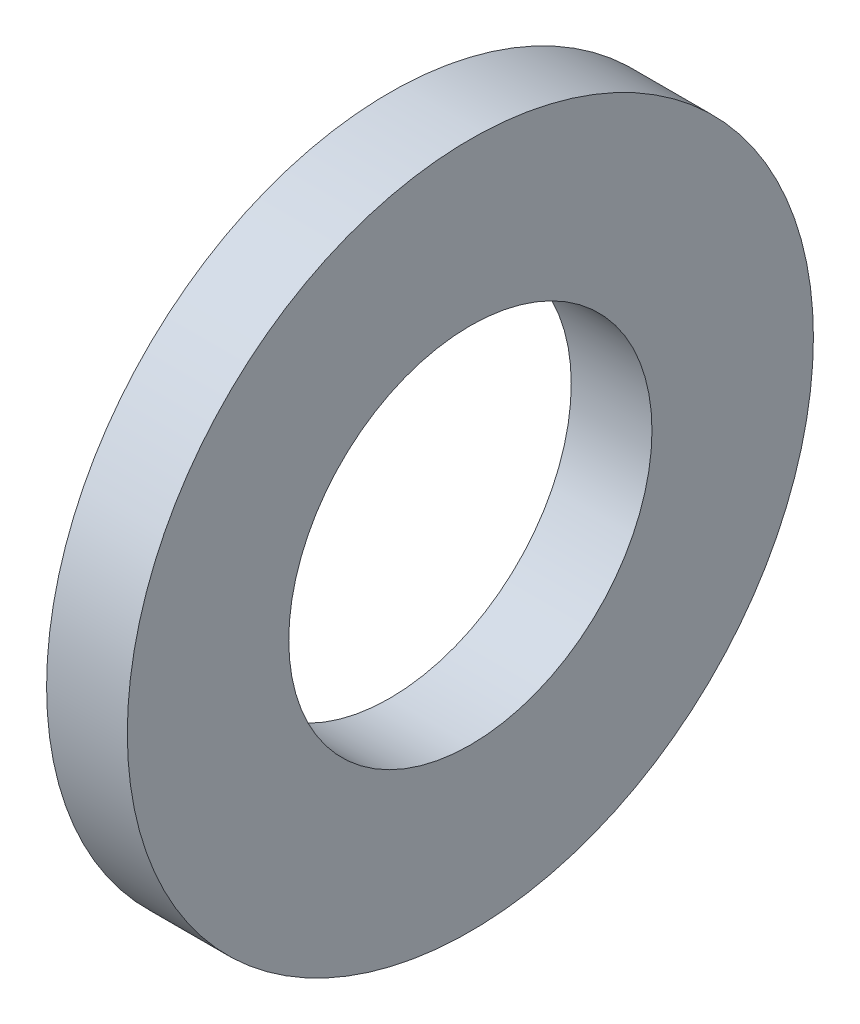
ISO-10303-21;
HEADER;
FILE_DESCRIPTION(('STEP AP214'),'2;1');
FILE_NAME('part.step','',(''),(''),'','','');
FILE_SCHEMA(('AUTOMOTIVE_DESIGN { 1 0 10303 214 1 1 1 1 }'));
ENDSEC;
DATA;
#1=APPLICATION_CONTEXT('core data for automotive mechanical design processes');
#2=APPLICATION_PROTOCOL_DEFINITION('international standard','automotive_design',2000,#1);
#3=PRODUCT_CONTEXT('',#1,'mechanical');
#4=PRODUCT('Part','Part','',(#3));
#5=PRODUCT_RELATED_PRODUCT_CATEGORY('part','',(#4));
#6=PRODUCT_DEFINITION_FORMATION('','',#4);
#7=PRODUCT_DEFINITION_CONTEXT('part definition',#1,'design');
#8=PRODUCT_DEFINITION('design','',#6,#7);
#9=PRODUCT_DEFINITION_SHAPE('','',#8);
#10=(LENGTH_UNIT() NAMED_UNIT(*) SI_UNIT(.MILLI.,.METRE.));
#11=(NAMED_UNIT(*) PLANE_ANGLE_UNIT() SI_UNIT($,.RADIAN.));
#12=(NAMED_UNIT(*) SI_UNIT($,.STERADIAN.) SOLID_ANGLE_UNIT());
#13=UNCERTAINTY_MEASURE_WITH_UNIT(LENGTH_MEASURE(1.E-05),#10,'distance_accuracy_value','');
#14=(GEOMETRIC_REPRESENTATION_CONTEXT(3) GLOBAL_UNCERTAINTY_ASSIGNED_CONTEXT((#13)) GLOBAL_UNIT_ASSIGNED_CONTEXT((#10,
#11,#12)) REPRESENTATION_CONTEXT('',''));
#15=CARTESIAN_POINT('',(0.,0.,0.));
#16=DIRECTION('',(0.,0.,1.));
#17=DIRECTION('',(1.,0.,0.));
#18=AXIS2_PLACEMENT_3D('',#15,#16,#17);
#19=CARTESIAN_POINT('',(-34.9249999999999,0.,0.));
#20=DIRECTION('',(-1.,0.,0.));
#21=DIRECTION('',(0.,0.,1.));
#22=AXIS2_PLACEMENT_3D('',#19,#20,#21);
#23=CYLINDRICAL_SURFACE('',#22,9.);
#24=CARTESIAN_POINT('',(0.,0.,0.));
#25=DIRECTION('',(-1.,0.,0.));
#26=DIRECTION('',(0.,0.,1.));
#27=AXIS2_PLACEMENT_3D('',#24,#25,#26);
#28=CIRCLE('',#27,9.);
#29=CARTESIAN_POINT('',(0.,0.,9.));
#30=VERTEX_POINT('',#29);
#31=EDGE_CURVE('E10',#30,#30,#28,.T.);
#32=ORIENTED_EDGE('',*,*,#31,.F.);
#33=EDGE_LOOP('',(#32));
#34=FACE_BOUND('',#33,.T.);
#35=CARTESIAN_POINT('',(-4.,0.,0.));
#36=DIRECTION('',(-1.,0.,0.));
#37=DIRECTION('',(0.,0.,1.));
#38=AXIS2_PLACEMENT_3D('',#35,#36,#37);
#39=CIRCLE('',#38,9.);
#40=CARTESIAN_POINT('',(-4.,0.,9.));
#41=VERTEX_POINT('',#40);
#42=EDGE_CURVE('E44',#41,#41,#39,.T.);
#43=ORIENTED_EDGE('',*,*,#42,.T.);
#44=EDGE_LOOP('',(#43));
#45=FACE_BOUND('',#44,.T.);
#46=ADVANCED_FACE('F30',(#34,#45),#23,.F.);
#47=CARTESIAN_POINT('',(0.,9.,0.));
#48=DIRECTION('',(-1.,0.,0.));
#49=DIRECTION('',(0.,0.,1.));
#50=AXIS2_PLACEMENT_3D('',#47,#48,#49);
#51=PLANE('',#50);
#52=CARTESIAN_POINT('',(0.,0.,0.));
#53=DIRECTION('',(-1.,0.,0.));
#54=DIRECTION('',(0.,0.,1.));
#55=AXIS2_PLACEMENT_3D('',#52,#53,#54);
#56=CIRCLE('',#55,17.);
#57=CARTESIAN_POINT('',(0.,0.,17.));
#58=VERTEX_POINT('',#57);
#59=EDGE_CURVE('E36',#58,#58,#56,.T.);
#60=ORIENTED_EDGE('',*,*,#59,.F.);
#61=EDGE_LOOP('',(#60));
#62=FACE_BOUND('',#61,.T.);
#63=ORIENTED_EDGE('',*,*,#31,.T.);
#64=EDGE_LOOP('',(#63));
#65=FACE_BOUND('',#64,.T.);
#66=ADVANCED_FACE('F59',(#62,#65),#51,.F.);
#67=CARTESIAN_POINT('',(-34.9249999999999,0.,0.));
#68=DIRECTION('',(-1.,0.,0.));
#69=DIRECTION('',(0.,0.,1.));
#70=AXIS2_PLACEMENT_3D('',#67,#68,#69);
#71=CYLINDRICAL_SURFACE('',#70,17.);
#72=CARTESIAN_POINT('',(-4.,0.,0.));
#73=DIRECTION('',(-1.,0.,0.));
#74=DIRECTION('',(0.,0.,1.));
#75=AXIS2_PLACEMENT_3D('',#72,#73,#74);
#76=CIRCLE('',#75,17.);
#77=CARTESIAN_POINT('',(-4.,0.,17.));
#78=VERTEX_POINT('',#77);
#79=EDGE_CURVE('E40',#78,#78,#76,.T.);
#80=ORIENTED_EDGE('',*,*,#79,.F.);
#81=EDGE_LOOP('',(#80));
#82=FACE_BOUND('',#81,.T.);
#83=ORIENTED_EDGE('',*,*,#59,.T.);
#84=EDGE_LOOP('',(#83));
#85=FACE_BOUND('',#84,.T.);
#86=ADVANCED_FACE('F54',(#82,#85),#71,.T.);
#87=CARTESIAN_POINT('',(-4.,17.,0.));
#88=DIRECTION('',(1.,0.,0.));
#89=DIRECTION('',(0.,0.,-1.));
#90=AXIS2_PLACEMENT_3D('',#87,#88,#89);
#91=PLANE('',#90);
#92=ORIENTED_EDGE('',*,*,#42,.F.);
#93=EDGE_LOOP('',(#92));
#94=FACE_BOUND('',#93,.T.);
#95=ORIENTED_EDGE('',*,*,#79,.T.);
#96=EDGE_LOOP('',(#95));
#97=FACE_BOUND('',#96,.T.);
#98=ADVANCED_FACE('F51',(#94,#97),#91,.F.);
#99=CLOSED_SHELL('',(#46,#66,#86,#98));
#100=MANIFOLD_SOLID_BREP('B2',#99);
#101=ADVANCED_BREP_SHAPE_REPRESENTATION('',(#18,#100),#14);
#102=SHAPE_DEFINITION_REPRESENTATION(#9,#101);
ENDSEC;
END-ISO-10303-21;
